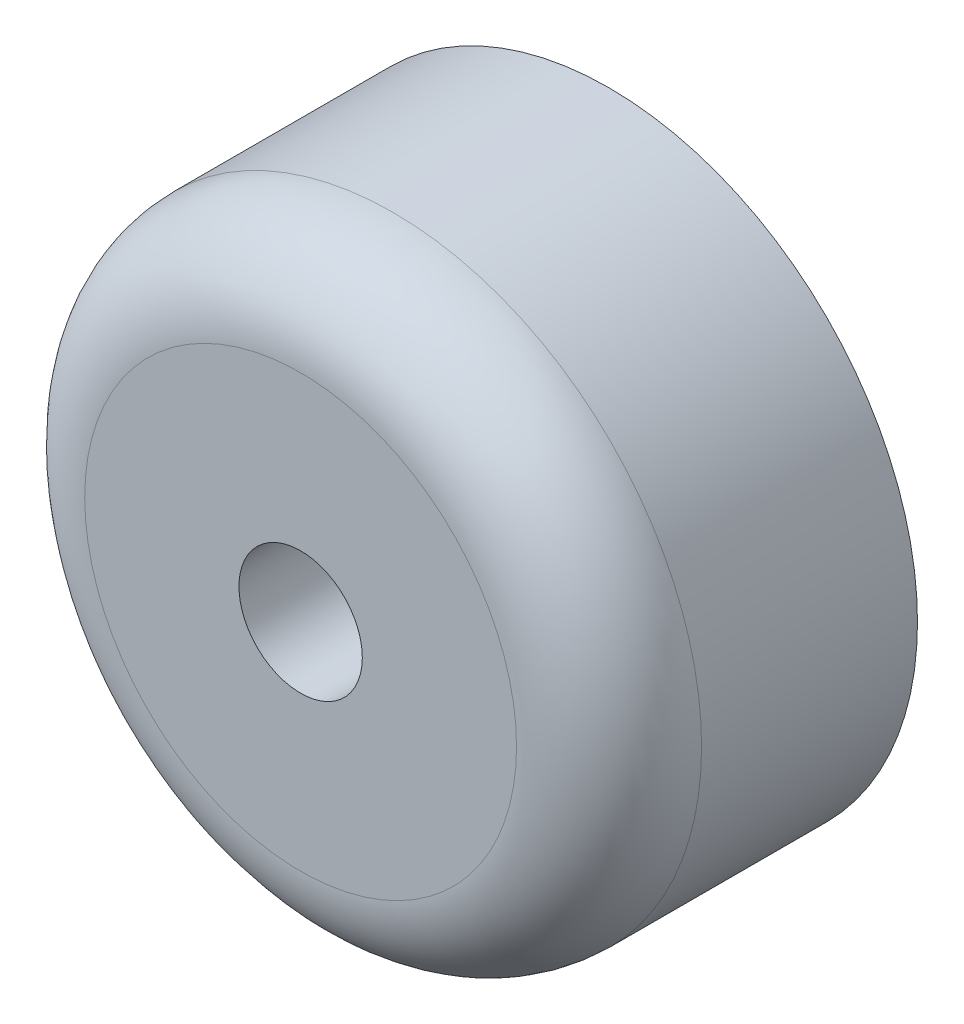
ISO-10303-21;
HEADER;
FILE_DESCRIPTION(('STEP AP214'),'2;1');
FILE_NAME('part.step','',(''),(''),'','','');
FILE_SCHEMA(('AUTOMOTIVE_DESIGN { 1 0 10303 214 1 1 1 1 }'));
ENDSEC;
DATA;
#1=APPLICATION_CONTEXT('core data for automotive mechanical design processes');
#2=APPLICATION_PROTOCOL_DEFINITION('international standard','automotive_design',2000,#1);
#3=PRODUCT_CONTEXT('',#1,'mechanical');
#4=PRODUCT('Part','Part','',(#3));
#5=PRODUCT_RELATED_PRODUCT_CATEGORY('part','',(#4));
#6=PRODUCT_DEFINITION_FORMATION('','',#4);
#7=PRODUCT_DEFINITION_CONTEXT('part definition',#1,'design');
#8=PRODUCT_DEFINITION('design','',#6,#7);
#9=PRODUCT_DEFINITION_SHAPE('','',#8);
#10=(LENGTH_UNIT() NAMED_UNIT(*) SI_UNIT(.MILLI.,.METRE.));
#11=(NAMED_UNIT(*) PLANE_ANGLE_UNIT() SI_UNIT($,.RADIAN.));
#12=(NAMED_UNIT(*) SI_UNIT($,.STERADIAN.) SOLID_ANGLE_UNIT());
#13=UNCERTAINTY_MEASURE_WITH_UNIT(LENGTH_MEASURE(1.E-05),#10,'distance_accuracy_value','');
#14=(GEOMETRIC_REPRESENTATION_CONTEXT(3) GLOBAL_UNCERTAINTY_ASSIGNED_CONTEXT((#13)) GLOBAL_UNIT_ASSIGNED_CONTEXT((#10,
#11,#12)) REPRESENTATION_CONTEXT('',''));
#15=CARTESIAN_POINT('',(0.,0.,0.));
#16=DIRECTION('',(0.,0.,1.));
#17=DIRECTION('',(1.,0.,0.));
#18=AXIS2_PLACEMENT_3D('',#15,#16,#17);
#19=CARTESIAN_POINT('',(0.,-3.6658190887617,10.));
#20=DIRECTION('',(0.,0.,-1.));
#21=DIRECTION('',(-1.,0.,0.));
#22=AXIS2_PLACEMENT_3D('',#19,#20,#21);
#23=CYLINDRICAL_SURFACE('',#22,10.);
#24=CARTESIAN_POINT('',(0.,-3.6658190887617,7.));
#25=DIRECTION('',(0.,0.,1.));
#26=DIRECTION('',(1.,0.,0.));
#27=AXIS2_PLACEMENT_3D('',#24,#25,#26);
#28=CIRCLE('',#27,10.);
#29=CARTESIAN_POINT('',(10.,-3.6658190887617,7.));
#30=VERTEX_POINT('',#29);
#31=EDGE_CURVE('E10',#30,#30,#28,.F.);
#32=ORIENTED_EDGE('',*,*,#31,.T.);
#33=EDGE_LOOP('',(#32));
#34=FACE_BOUND('',#33,.T.);
#35=CARTESIAN_POINT('',(0.,-3.6658190887617,0.));
#36=DIRECTION('',(0.,0.,1.));
#37=DIRECTION('',(1.,0.,0.));
#38=AXIS2_PLACEMENT_3D('',#35,#36,#37);
#39=CIRCLE('',#38,10.);
#40=CARTESIAN_POINT('',(10.,-3.6658190887617,0.));
#41=VERTEX_POINT('',#40);
#42=EDGE_CURVE('E46',#41,#41,#39,.T.);
#43=ORIENTED_EDGE('',*,*,#42,.T.);
#44=EDGE_LOOP('',(#43));
#45=FACE_BOUND('',#44,.T.);
#46=ADVANCED_FACE('F35',(#34,#45),#23,.T.);
#47=CARTESIAN_POINT('',(0.,-3.6658190887617,10.));
#48=DIRECTION('',(0.,0.,1.));
#49=DIRECTION('',(1.,0.,0.));
#50=AXIS2_PLACEMENT_3D('',#47,#48,#49);
#51=PLANE('',#50);
#52=CARTESIAN_POINT('',(0.,-3.6658190887617,10.));
#53=DIRECTION('',(0.,0.,1.));
#54=DIRECTION('',(1.,0.,0.));
#55=AXIS2_PLACEMENT_3D('',#52,#53,#54);
#56=CIRCLE('',#55,2.);
#57=CARTESIAN_POINT('',(2.00000000000001,-3.6658190887617,10.));
#58=VERTEX_POINT('',#57);
#59=EDGE_CURVE('E53',#58,#58,#56,.T.);
#60=ORIENTED_EDGE('',*,*,#59,.F.);
#61=EDGE_LOOP('',(#60));
#62=FACE_BOUND('',#61,.T.);
#63=CARTESIAN_POINT('',(0.,-3.6658190887617,10.));
#64=DIRECTION('',(0.,0.,1.));
#65=DIRECTION('',(1.,0.,0.));
#66=AXIS2_PLACEMENT_3D('',#63,#64,#65);
#67=CIRCLE('',#66,7.);
#68=CARTESIAN_POINT('',(7.00000000000001,-3.6658190887617,10.));
#69=VERTEX_POINT('',#68);
#70=EDGE_CURVE('E42',#69,#69,#67,.T.);
#71=ORIENTED_EDGE('',*,*,#70,.T.);
#72=EDGE_LOOP('',(#71));
#73=FACE_BOUND('',#72,.T.);
#74=ADVANCED_FACE('F67',(#62,#73),#51,.T.);
#75=CARTESIAN_POINT('',(0.,-3.6658190887617,0.));
#76=DIRECTION('',(0.,0.,1.));
#77=DIRECTION('',(1.,0.,0.));
#78=AXIS2_PLACEMENT_3D('',#75,#76,#77);
#79=PLANE('',#78);
#80=ORIENTED_EDGE('',*,*,#42,.F.);
#81=EDGE_LOOP('',(#80));
#82=FACE_BOUND('',#81,.T.);
#83=ADVANCED_FACE('F69',(#82),#79,.F.);
#84=CARTESIAN_POINT('',(0.,-3.6658190887617,7.));
#85=DIRECTION('',(0.,0.,1.));
#86=DIRECTION('',(1.,0.,0.));
#87=AXIS2_PLACEMENT_3D('',#84,#85,#86);
#88=TOROIDAL_SURFACE('',#87,7.,3.);
#89=ORIENTED_EDGE('',*,*,#31,.F.);
#90=EDGE_LOOP('',(#89));
#91=FACE_BOUND('',#90,.T.);
#92=ORIENTED_EDGE('',*,*,#70,.F.);
#93=EDGE_LOOP('',(#92));
#94=FACE_BOUND('',#93,.T.);
#95=ADVANCED_FACE('F37',(#91,#94),#88,.T.);
#96=CARTESIAN_POINT('',(0.,-3.6658190887617,3.));
#97=DIRECTION('',(0.,0.,1.));
#98=DIRECTION('',(1.,0.,0.));
#99=AXIS2_PLACEMENT_3D('',#96,#97,#98);
#100=CYLINDRICAL_SURFACE('',#99,2.);
#101=CARTESIAN_POINT('',(0.,-3.6658190887617,3.));
#102=DIRECTION('',(0.,0.,1.));
#103=DIRECTION('',(1.,0.,0.));
#104=AXIS2_PLACEMENT_3D('',#101,#102,#103);
#105=CIRCLE('',#104,2.);
#106=CARTESIAN_POINT('',(2.00000000000001,-3.6658190887617,3.));
#107=VERTEX_POINT('',#106);
#108=EDGE_CURVE('E50',#107,#107,#105,.T.);
#109=ORIENTED_EDGE('',*,*,#108,.F.);
#110=EDGE_LOOP('',(#109));
#111=FACE_BOUND('',#110,.T.);
#112=ORIENTED_EDGE('',*,*,#59,.T.);
#113=EDGE_LOOP('',(#112));
#114=FACE_BOUND('',#113,.T.);
#115=ADVANCED_FACE('F61',(#111,#114),#100,.F.);
#116=CARTESIAN_POINT('',(0.,-3.6658190887617,3.));
#117=DIRECTION('',(0.,0.,1.));
#118=DIRECTION('',(1.,0.,0.));
#119=AXIS2_PLACEMENT_3D('',#116,#117,#118);
#120=PLANE('',#119);
#121=ORIENTED_EDGE('',*,*,#108,.T.);
#122=EDGE_LOOP('',(#121));
#123=FACE_BOUND('',#122,.T.);
#124=ADVANCED_FACE('F59',(#123),#120,.T.);
#125=CLOSED_SHELL('',(#46,#74,#83,#95,#115,#124));
#126=MANIFOLD_SOLID_BREP('B2',#125);
#127=ADVANCED_BREP_SHAPE_REPRESENTATION('',(#18,#126),#14);
#128=SHAPE_DEFINITION_REPRESENTATION(#9,#127);
ENDSEC;
END-ISO-10303-21;
